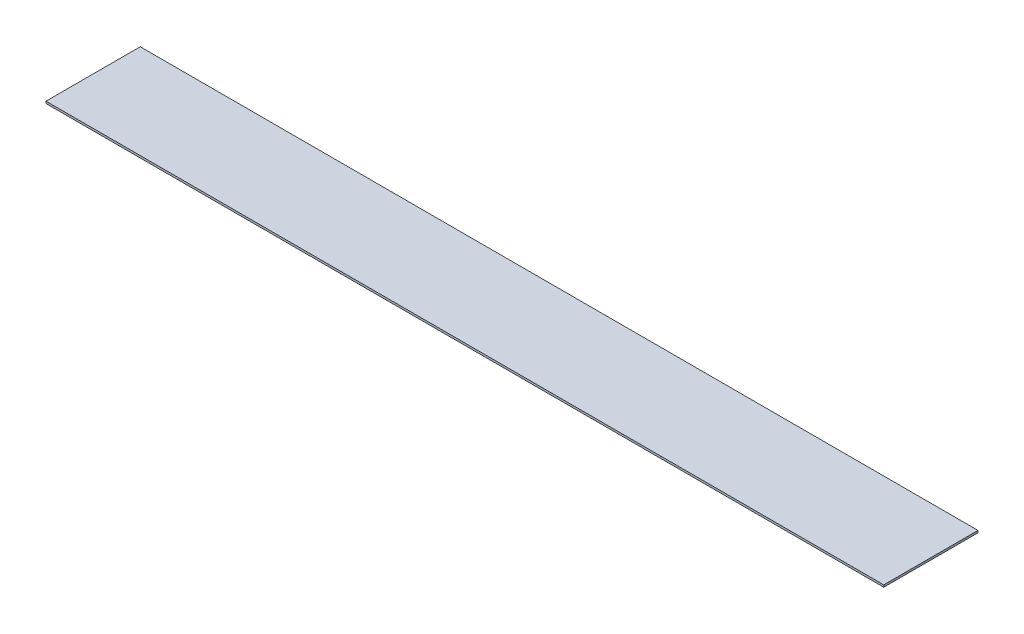
ISO-10303-21;
HEADER;
FILE_DESCRIPTION(('STEP AP214'),'2;1');
FILE_NAME('part.step','',(''),(''),'','','');
FILE_SCHEMA(('AUTOMOTIVE_DESIGN { 1 0 10303 214 1 1 1 1 }'));
ENDSEC;
DATA;
#1=APPLICATION_CONTEXT('core data for automotive mechanical design processes');
#2=APPLICATION_PROTOCOL_DEFINITION('international standard','automotive_design',2000,#1);
#3=PRODUCT_CONTEXT('',#1,'mechanical');
#4=PRODUCT('Part','Part','',(#3));
#5=PRODUCT_RELATED_PRODUCT_CATEGORY('part','',(#4));
#6=PRODUCT_DEFINITION_FORMATION('','',#4);
#7=PRODUCT_DEFINITION_CONTEXT('part definition',#1,'design');
#8=PRODUCT_DEFINITION('design','',#6,#7);
#9=PRODUCT_DEFINITION_SHAPE('','',#8);
#10=(LENGTH_UNIT() NAMED_UNIT(*) SI_UNIT(.MILLI.,.METRE.));
#11=(NAMED_UNIT(*) PLANE_ANGLE_UNIT() SI_UNIT($,.RADIAN.));
#12=(NAMED_UNIT(*) SI_UNIT($,.STERADIAN.) SOLID_ANGLE_UNIT());
#13=UNCERTAINTY_MEASURE_WITH_UNIT(LENGTH_MEASURE(1.E-05),#10,'distance_accuracy_value','');
#14=(GEOMETRIC_REPRESENTATION_CONTEXT(3) GLOBAL_UNCERTAINTY_ASSIGNED_CONTEXT((#13)) GLOBAL_UNIT_ASSIGNED_CONTEXT((#10,
#11,#12)) REPRESENTATION_CONTEXT('',''));
#15=CARTESIAN_POINT('',(0.,0.,0.));
#16=DIRECTION('',(0.,0.,1.));
#17=DIRECTION('',(1.,0.,0.));
#18=AXIS2_PLACEMENT_3D('',#15,#16,#17);
#19=CARTESIAN_POINT('',(2000.,10.,-225.));
#20=DIRECTION('',(-1.,0.,0.));
#21=DIRECTION('',(0.,0.,1.));
#22=AXIS2_PLACEMENT_3D('',#19,#20,#21);
#23=PLANE('',#22);
#24=DIRECTION('',(0.,0.,-1.));
#25=VECTOR('',#24,1.);
#26=CARTESIAN_POINT('',(2000.,0.,-225.));
#27=LINE('',#26,#25);
#28=CARTESIAN_POINT('',(2000.,0.,225.));
#29=VERTEX_POINT('',#28);
#30=CARTESIAN_POINT('',(2000.,0.,-225.));
#31=VERTEX_POINT('',#30);
#32=EDGE_CURVE('E113',#29,#31,#27,.T.);
#33=ORIENTED_EDGE('',*,*,#32,.T.);
#34=DIRECTION('',(0.,-1.,0.));
#35=VECTOR('',#34,1.);
#36=CARTESIAN_POINT('',(2000.,10.,-225.));
#37=LINE('',#36,#35);
#38=CARTESIAN_POINT('',(2000.,10.,-225.));
#39=VERTEX_POINT('',#38);
#40=EDGE_CURVE('E11',#39,#31,#37,.T.);
#41=ORIENTED_EDGE('',*,*,#40,.F.);
#42=DIRECTION('',(0.,0.,-1.));
#43=VECTOR('',#42,1.);
#44=CARTESIAN_POINT('',(2000.,10.,-225.));
#45=LINE('',#44,#43);
#46=CARTESIAN_POINT('',(2000.,10.,225.));
#47=VERTEX_POINT('',#46);
#48=EDGE_CURVE('E97',#47,#39,#45,.T.);
#49=ORIENTED_EDGE('',*,*,#48,.F.);
#50=DIRECTION('',(0.,-1.,0.));
#51=VECTOR('',#50,1.);
#52=CARTESIAN_POINT('',(2000.,10.,225.));
#53=LINE('',#52,#51);
#54=EDGE_CURVE('E109',#47,#29,#53,.T.);
#55=ORIENTED_EDGE('',*,*,#54,.T.);
#56=EDGE_LOOP('',(#33,#41,#49,#55));
#57=FACE_BOUND('',#56,.T.);
#58=ADVANCED_FACE('F45',(#57),#23,.F.);
#59=CARTESIAN_POINT('',(-2000.,10.,-225.));
#60=DIRECTION('',(0.,0.,1.));
#61=DIRECTION('',(1.,0.,0.));
#62=AXIS2_PLACEMENT_3D('',#59,#60,#61);
#63=PLANE('',#62);
#64=DIRECTION('',(-1.,0.,0.));
#65=VECTOR('',#64,1.);
#66=CARTESIAN_POINT('',(-2000.,0.,-225.));
#67=LINE('',#66,#65);
#68=CARTESIAN_POINT('',(-2000.,0.,-225.));
#69=VERTEX_POINT('',#68);
#70=EDGE_CURVE('E102',#31,#69,#67,.T.);
#71=ORIENTED_EDGE('',*,*,#70,.T.);
#72=DIRECTION('',(0.,-1.,0.));
#73=VECTOR('',#72,1.);
#74=CARTESIAN_POINT('',(-2000.,10.,-225.));
#75=LINE('',#74,#73);
#76=CARTESIAN_POINT('',(-2000.,10.,-225.));
#77=VERTEX_POINT('',#76);
#78=EDGE_CURVE('E54',#77,#69,#75,.T.);
#79=ORIENTED_EDGE('',*,*,#78,.F.);
#80=DIRECTION('',(-1.,0.,0.));
#81=VECTOR('',#80,1.);
#82=CARTESIAN_POINT('',(-2000.,10.,-225.));
#83=LINE('',#82,#81);
#84=EDGE_CURVE('E92',#39,#77,#83,.T.);
#85=ORIENTED_EDGE('',*,*,#84,.F.);
#86=ORIENTED_EDGE('',*,*,#40,.T.);
#87=EDGE_LOOP('',(#71,#79,#85,#86));
#88=FACE_BOUND('',#87,.T.);
#89=ADVANCED_FACE('F101',(#88),#63,.F.);
#90=CARTESIAN_POINT('',(-2000.,10.,-225.));
#91=DIRECTION('',(1.,0.,0.));
#92=DIRECTION('',(0.,0.,-1.));
#93=AXIS2_PLACEMENT_3D('',#90,#91,#92);
#94=PLANE('',#93);
#95=DIRECTION('',(0.,0.,1.));
#96=VECTOR('',#95,1.);
#97=CARTESIAN_POINT('',(-2000.,0.,-225.));
#98=LINE('',#97,#96);
#99=CARTESIAN_POINT('',(-2000.,0.,225.));
#100=VERTEX_POINT('',#99);
#101=EDGE_CURVE('E79',#69,#100,#98,.T.);
#102=ORIENTED_EDGE('',*,*,#101,.T.);
#103=DIRECTION('',(0.,-1.,0.));
#104=VECTOR('',#103,1.);
#105=CARTESIAN_POINT('',(-2000.,10.,225.));
#106=LINE('',#105,#104);
#107=CARTESIAN_POINT('',(-2000.,10.,225.));
#108=VERTEX_POINT('',#107);
#109=EDGE_CURVE('E104',#108,#100,#106,.T.);
#110=ORIENTED_EDGE('',*,*,#109,.F.);
#111=DIRECTION('',(0.,0.,1.));
#112=VECTOR('',#111,1.);
#113=CARTESIAN_POINT('',(-2000.,10.,-225.));
#114=LINE('',#113,#112);
#115=EDGE_CURVE('E95',#77,#108,#114,.T.);
#116=ORIENTED_EDGE('',*,*,#115,.F.);
#117=ORIENTED_EDGE('',*,*,#78,.T.);
#118=EDGE_LOOP('',(#102,#110,#116,#117));
#119=FACE_BOUND('',#118,.T.);
#120=ADVANCED_FACE('F105',(#119),#94,.F.);
#121=CARTESIAN_POINT('',(-2000.,10.,225.));
#122=DIRECTION('',(0.,0.,-1.));
#123=DIRECTION('',(-1.,0.,0.));
#124=AXIS2_PLACEMENT_3D('',#121,#122,#123);
#125=PLANE('',#124);
#126=DIRECTION('',(1.,0.,0.));
#127=VECTOR('',#126,1.);
#128=CARTESIAN_POINT('',(-2000.,0.,225.));
#129=LINE('',#128,#127);
#130=EDGE_CURVE('E85',#100,#29,#129,.T.);
#131=ORIENTED_EDGE('',*,*,#130,.T.);
#132=ORIENTED_EDGE('',*,*,#54,.F.);
#133=DIRECTION('',(1.,0.,0.));
#134=VECTOR('',#133,1.);
#135=CARTESIAN_POINT('',(-2000.,10.,225.));
#136=LINE('',#135,#134);
#137=EDGE_CURVE('E62',#108,#47,#136,.T.);
#138=ORIENTED_EDGE('',*,*,#137,.F.);
#139=ORIENTED_EDGE('',*,*,#109,.T.);
#140=EDGE_LOOP('',(#131,#132,#138,#139));
#141=FACE_BOUND('',#140,.T.);
#142=ADVANCED_FACE('F126',(#141),#125,.F.);
#143=CARTESIAN_POINT('',(0.,10.,0.));
#144=DIRECTION('',(0.,1.,0.));
#145=DIRECTION('',(0.,0.,1.));
#146=AXIS2_PLACEMENT_3D('',#143,#144,#145);
#147=PLANE('',#146);
#148=ORIENTED_EDGE('',*,*,#48,.T.);
#149=ORIENTED_EDGE('',*,*,#84,.T.);
#150=ORIENTED_EDGE('',*,*,#115,.T.);
#151=ORIENTED_EDGE('',*,*,#137,.T.);
#152=EDGE_LOOP('',(#148,#149,#150,#151));
#153=FACE_BOUND('',#152,.T.);
#154=ADVANCED_FACE('F93',(#153),#147,.T.);
#155=CARTESIAN_POINT('',(0.,0.,0.));
#156=DIRECTION('',(0.,1.,0.));
#157=DIRECTION('',(0.,0.,1.));
#158=AXIS2_PLACEMENT_3D('',#155,#156,#157);
#159=PLANE('',#158);
#160=ORIENTED_EDGE('',*,*,#32,.F.);
#161=ORIENTED_EDGE('',*,*,#130,.F.);
#162=ORIENTED_EDGE('',*,*,#101,.F.);
#163=ORIENTED_EDGE('',*,*,#70,.F.);
#164=EDGE_LOOP('',(#160,#161,#162,#163));
#165=FACE_BOUND('',#164,.T.);
#166=ADVANCED_FACE('F129',(#165),#159,.F.);
#167=CLOSED_SHELL('',(#58,#89,#120,#142,#154,#166));
#168=MANIFOLD_SOLID_BREP('B2',#167);
#169=ADVANCED_BREP_SHAPE_REPRESENTATION('',(#18,#168),#14);
#170=SHAPE_DEFINITION_REPRESENTATION(#9,#169);
ENDSEC;
END-ISO-10303-21;
